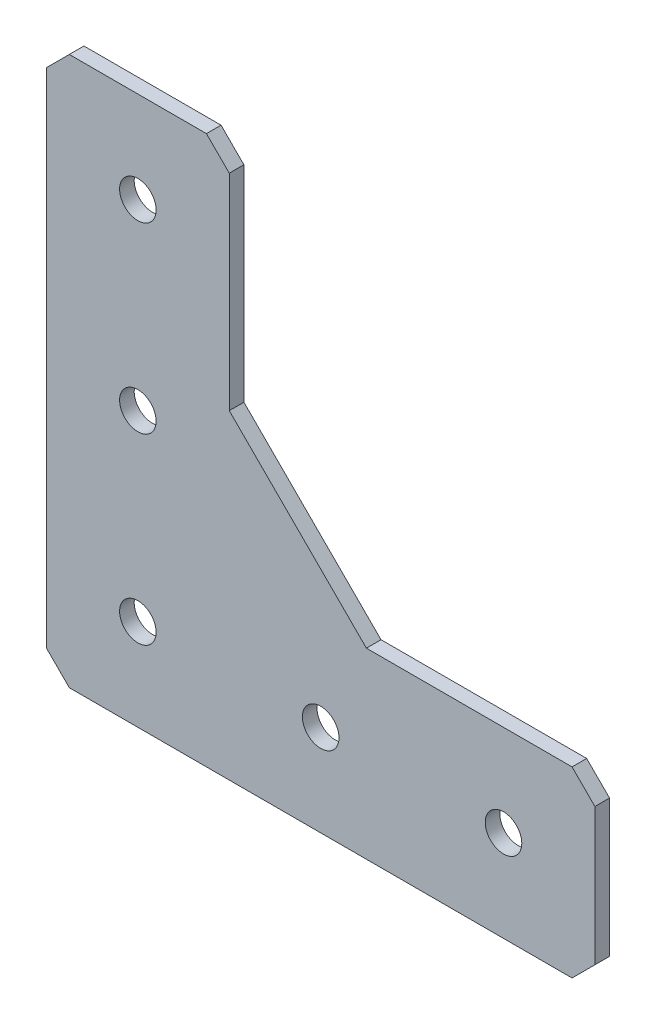
ISO-10303-21;
HEADER;
FILE_DESCRIPTION(('STEP AP214'),'2;1');
FILE_NAME('part.step','',(''),(''),'','','');
FILE_SCHEMA(('AUTOMOTIVE_DESIGN { 1 0 10303 214 1 1 1 1 }'));
ENDSEC;
DATA;
#1=APPLICATION_CONTEXT('core data for automotive mechanical design processes');
#2=APPLICATION_PROTOCOL_DEFINITION('international standard','automotive_design',2000,#1);
#3=PRODUCT_CONTEXT('',#1,'mechanical');
#4=PRODUCT('Part','Part','',(#3));
#5=PRODUCT_RELATED_PRODUCT_CATEGORY('part','',(#4));
#6=PRODUCT_DEFINITION_FORMATION('','',#4);
#7=PRODUCT_DEFINITION_CONTEXT('part definition',#1,'design');
#8=PRODUCT_DEFINITION('design','',#6,#7);
#9=PRODUCT_DEFINITION_SHAPE('','',#8);
#10=(LENGTH_UNIT() NAMED_UNIT(*) SI_UNIT(.MILLI.,.METRE.));
#11=(NAMED_UNIT(*) PLANE_ANGLE_UNIT() SI_UNIT($,.RADIAN.));
#12=(NAMED_UNIT(*) SI_UNIT($,.STERADIAN.) SOLID_ANGLE_UNIT());
#13=UNCERTAINTY_MEASURE_WITH_UNIT(LENGTH_MEASURE(1.E-05),#10,'distance_accuracy_value','');
#14=(GEOMETRIC_REPRESENTATION_CONTEXT(3) GLOBAL_UNCERTAINTY_ASSIGNED_CONTEXT((#13)) GLOBAL_UNIT_ASSIGNED_CONTEXT((#10,
#11,#12)) REPRESENTATION_CONTEXT('',''));
#15=CARTESIAN_POINT('',(0.,0.,0.));
#16=DIRECTION('',(0.,0.,1.));
#17=DIRECTION('',(1.,0.,0.));
#18=AXIS2_PLACEMENT_3D('',#15,#16,#17);
#19=CARTESIAN_POINT('',(0.,0.,1.016));
#20=DIRECTION('',(0.,0.,1.));
#21=DIRECTION('',(1.,0.,0.));
#22=AXIS2_PLACEMENT_3D('',#19,#20,#21);
#23=PLANE('',#22);
#24=CARTESIAN_POINT('',(38.1,12.7,1.016));
#25=DIRECTION('',(0.,0.,1.));
#26=DIRECTION('',(1.,0.,0.));
#27=AXIS2_PLACEMENT_3D('',#24,#25,#26);
#28=CIRCLE('',#27,2.54);
#29=CARTESIAN_POINT('',(40.64,12.7,1.016));
#30=VERTEX_POINT('',#29);
#31=EDGE_CURVE('E298',#30,#30,#28,.T.);
#32=ORIENTED_EDGE('',*,*,#31,.F.);
#33=EDGE_LOOP('',(#32));
#34=FACE_BOUND('',#33,.T.);
#35=CARTESIAN_POINT('',(12.7,38.1,1.016));
#36=DIRECTION('',(0.,0.,1.));
#37=DIRECTION('',(1.,0.,0.));
#38=AXIS2_PLACEMENT_3D('',#35,#36,#37);
#39=CIRCLE('',#38,2.53999999999999);
#40=CARTESIAN_POINT('',(15.24,38.1,1.016));
#41=VERTEX_POINT('',#40);
#42=EDGE_CURVE('E310',#41,#41,#39,.T.);
#43=ORIENTED_EDGE('',*,*,#42,.F.);
#44=EDGE_LOOP('',(#43));
#45=FACE_BOUND('',#44,.T.);
#46=DIRECTION('',(-0.70710678118655,0.707106781186545,0.));
#47=VECTOR('',#46,1.);
#48=CARTESIAN_POINT('',(76.2,22.225,1.016));
#49=LINE('',#48,#47);
#50=CARTESIAN_POINT('',(76.2,22.225,1.016));
#51=VERTEX_POINT('',#50);
#52=CARTESIAN_POINT('',(73.0249999999999,25.4,1.016));
#53=VERTEX_POINT('',#52);
#54=EDGE_CURVE('E179',#51,#53,#49,.T.);
#55=ORIENTED_EDGE('',*,*,#54,.T.);
#56=DIRECTION('',(-1.,0.,0.));
#57=VECTOR('',#56,1.);
#58=CARTESIAN_POINT('',(73.0249999999999,25.4,1.016));
#59=LINE('',#58,#57);
#60=CARTESIAN_POINT('',(44.45,25.4,1.016));
#61=VERTEX_POINT('',#60);
#62=EDGE_CURVE('E107',#53,#61,#59,.T.);
#63=ORIENTED_EDGE('',*,*,#62,.T.);
#64=DIRECTION('',(-0.707106781186544,0.707106781186551,0.));
#65=VECTOR('',#64,1.);
#66=CARTESIAN_POINT('',(44.45,25.4,1.016));
#67=LINE('',#66,#65);
#68=CARTESIAN_POINT('',(25.4,44.4500000000001,1.016));
#69=VERTEX_POINT('',#68);
#70=EDGE_CURVE('E206',#61,#69,#67,.T.);
#71=ORIENTED_EDGE('',*,*,#70,.T.);
#72=DIRECTION('',(0.,1.,0.));
#73=VECTOR('',#72,1.);
#74=CARTESIAN_POINT('',(25.4,44.4500000000001,1.016));
#75=LINE('',#74,#73);
#76=CARTESIAN_POINT('',(25.4,73.025,1.016));
#77=VERTEX_POINT('',#76);
#78=EDGE_CURVE('E225',#69,#77,#75,.T.);
#79=ORIENTED_EDGE('',*,*,#78,.T.);
#80=DIRECTION('',(-0.707106781186545,0.70710678118655,0.));
#81=VECTOR('',#80,1.);
#82=CARTESIAN_POINT('',(25.4,73.025,1.016));
#83=LINE('',#82,#81);
#84=CARTESIAN_POINT('',(22.225,76.2,1.016));
#85=VERTEX_POINT('',#84);
#86=EDGE_CURVE('E222',#77,#85,#83,.T.);
#87=ORIENTED_EDGE('',*,*,#86,.T.);
#88=DIRECTION('',(-1.,0.,0.));
#89=VECTOR('',#88,1.);
#90=CARTESIAN_POINT('',(22.225,76.2,1.016));
#91=LINE('',#90,#89);
#92=CARTESIAN_POINT('',(3.17500000000003,76.2,1.016));
#93=VERTEX_POINT('',#92);
#94=EDGE_CURVE('E224',#85,#93,#91,.T.);
#95=ORIENTED_EDGE('',*,*,#94,.T.);
#96=DIRECTION('',(-0.707106781186553,-0.707106781186542,0.));
#97=VECTOR('',#96,1.);
#98=CARTESIAN_POINT('',(3.17500000000003,76.2,1.016));
#99=LINE('',#98,#97);
#100=CARTESIAN_POINT('',(0.,73.025,1.016));
#101=VERTEX_POINT('',#100);
#102=EDGE_CURVE('E227',#93,#101,#99,.T.);
#103=ORIENTED_EDGE('',*,*,#102,.T.);
#104=DIRECTION('',(0.,-1.,0.));
#105=VECTOR('',#104,1.);
#106=CARTESIAN_POINT('',(0.,73.025,1.016));
#107=LINE('',#106,#105);
#108=CARTESIAN_POINT('',(0.,3.17500000000001,1.016));
#109=VERTEX_POINT('',#108);
#110=EDGE_CURVE('E233',#101,#109,#107,.T.);
#111=ORIENTED_EDGE('',*,*,#110,.T.);
#112=DIRECTION('',(0.707106781186546,-0.707106781186549,0.));
#113=VECTOR('',#112,1.);
#114=CARTESIAN_POINT('',(0.,3.17500000000001,1.016));
#115=LINE('',#114,#113);
#116=CARTESIAN_POINT('',(3.175,0.,1.016));
#117=VERTEX_POINT('',#116);
#118=EDGE_CURVE('E138',#109,#117,#115,.T.);
#119=ORIENTED_EDGE('',*,*,#118,.T.);
#120=DIRECTION('',(1.,0.,0.));
#121=VECTOR('',#120,1.);
#122=CARTESIAN_POINT('',(3.175,0.,1.016));
#123=LINE('',#122,#121);
#124=CARTESIAN_POINT('',(73.0249999999999,0.,1.016));
#125=VERTEX_POINT('',#124);
#126=EDGE_CURVE('E132',#117,#125,#123,.T.);
#127=ORIENTED_EDGE('',*,*,#126,.T.);
#128=DIRECTION('',(0.707106781186551,0.707106781186544,0.));
#129=VECTOR('',#128,1.);
#130=CARTESIAN_POINT('',(73.0249999999999,0.,1.016));
#131=LINE('',#130,#129);
#132=CARTESIAN_POINT('',(76.2,3.175,1.016));
#133=VERTEX_POINT('',#132);
#134=EDGE_CURVE('E136',#125,#133,#131,.T.);
#135=ORIENTED_EDGE('',*,*,#134,.T.);
#136=DIRECTION('',(0.,1.,0.));
#137=VECTOR('',#136,1.);
#138=CARTESIAN_POINT('',(76.2,3.175,1.016));
#139=LINE('',#138,#137);
#140=EDGE_CURVE('E52',#133,#51,#139,.T.);
#141=ORIENTED_EDGE('',*,*,#140,.T.);
#142=EDGE_LOOP('',(#55,#63,#71,#79,#87,#95,#103,#111,#119,#127,#135,#141));
#143=FACE_BOUND('',#142,.T.);
#144=CARTESIAN_POINT('',(12.7,12.7,1.016));
#145=DIRECTION('',(0.,0.,1.));
#146=DIRECTION('',(1.,0.,0.));
#147=AXIS2_PLACEMENT_3D('',#144,#145,#146);
#148=CIRCLE('',#147,2.53999999999999);
#149=CARTESIAN_POINT('',(15.24,12.7,1.016));
#150=VERTEX_POINT('',#149);
#151=EDGE_CURVE('E160',#150,#150,#148,.T.);
#152=ORIENTED_EDGE('',*,*,#151,.F.);
#153=EDGE_LOOP('',(#152));
#154=FACE_BOUND('',#153,.T.);
#155=CARTESIAN_POINT('',(12.7,63.5,1.016));
#156=DIRECTION('',(0.,0.,1.));
#157=DIRECTION('',(1.,0.,0.));
#158=AXIS2_PLACEMENT_3D('',#155,#156,#157);
#159=CIRCLE('',#158,2.53999999999999);
#160=CARTESIAN_POINT('',(15.24,63.5,1.016));
#161=VERTEX_POINT('',#160);
#162=EDGE_CURVE('E304',#161,#161,#159,.T.);
#163=ORIENTED_EDGE('',*,*,#162,.F.);
#164=EDGE_LOOP('',(#163));
#165=FACE_BOUND('',#164,.T.);
#166=CARTESIAN_POINT('',(63.5,12.7,1.016));
#167=DIRECTION('',(0.,0.,1.));
#168=DIRECTION('',(1.,0.,0.));
#169=AXIS2_PLACEMENT_3D('',#166,#167,#168);
#170=CIRCLE('',#169,2.54000000000001);
#171=CARTESIAN_POINT('',(66.04,12.7,1.016));
#172=VERTEX_POINT('',#171);
#173=EDGE_CURVE('E289',#172,#172,#170,.T.);
#174=ORIENTED_EDGE('',*,*,#173,.F.);
#175=EDGE_LOOP('',(#174));
#176=FACE_BOUND('',#175,.T.);
#177=ADVANCED_FACE('F35',(#34,#45,#143,#154,#165,#176),#23,.T.);
#178=CARTESIAN_POINT('',(0.,0.,-1.016));
#179=DIRECTION('',(0.,0.,1.));
#180=DIRECTION('',(1.,0.,0.));
#181=AXIS2_PLACEMENT_3D('',#178,#179,#180);
#182=PLANE('',#181);
#183=CARTESIAN_POINT('',(38.1,12.7,-1.016));
#184=DIRECTION('',(0.,0.,1.));
#185=DIRECTION('',(1.,0.,0.));
#186=AXIS2_PLACEMENT_3D('',#183,#184,#185);
#187=CIRCLE('',#186,2.54);
#188=CARTESIAN_POINT('',(40.64,12.7,-1.016));
#189=VERTEX_POINT('',#188);
#190=EDGE_CURVE('E295',#189,#189,#187,.T.);
#191=ORIENTED_EDGE('',*,*,#190,.T.);
#192=EDGE_LOOP('',(#191));
#193=FACE_BOUND('',#192,.T.);
#194=CARTESIAN_POINT('',(12.7,38.1,-1.016));
#195=DIRECTION('',(0.,0.,1.));
#196=DIRECTION('',(1.,0.,0.));
#197=AXIS2_PLACEMENT_3D('',#194,#195,#196);
#198=CIRCLE('',#197,2.53999999999999);
#199=CARTESIAN_POINT('',(15.24,38.1,-1.016));
#200=VERTEX_POINT('',#199);
#201=EDGE_CURVE('E307',#200,#200,#198,.T.);
#202=ORIENTED_EDGE('',*,*,#201,.T.);
#203=EDGE_LOOP('',(#202));
#204=FACE_BOUND('',#203,.T.);
#205=DIRECTION('',(-0.70710678118655,0.707106781186545,0.));
#206=VECTOR('',#205,1.);
#207=CARTESIAN_POINT('',(76.2,22.225,-1.016));
#208=LINE('',#207,#206);
#209=CARTESIAN_POINT('',(76.2,22.225,-1.016));
#210=VERTEX_POINT('',#209);
#211=CARTESIAN_POINT('',(73.0249999999999,25.4,-1.016));
#212=VERTEX_POINT('',#211);
#213=EDGE_CURVE('E156',#210,#212,#208,.T.);
#214=ORIENTED_EDGE('',*,*,#213,.F.);
#215=DIRECTION('',(0.,1.,0.));
#216=VECTOR('',#215,1.);
#217=CARTESIAN_POINT('',(76.2,3.175,-1.016));
#218=LINE('',#217,#216);
#219=CARTESIAN_POINT('',(76.2,3.175,-1.016));
#220=VERTEX_POINT('',#219);
#221=EDGE_CURVE('E99',#220,#210,#218,.T.);
#222=ORIENTED_EDGE('',*,*,#221,.F.);
#223=DIRECTION('',(0.707106781186551,0.707106781186544,0.));
#224=VECTOR('',#223,1.);
#225=CARTESIAN_POINT('',(73.0249999999999,0.,-1.016));
#226=LINE('',#225,#224);
#227=CARTESIAN_POINT('',(73.0249999999999,0.,-1.016));
#228=VERTEX_POINT('',#227);
#229=EDGE_CURVE('E93',#228,#220,#226,.T.);
#230=ORIENTED_EDGE('',*,*,#229,.F.);
#231=DIRECTION('',(1.,0.,0.));
#232=VECTOR('',#231,1.);
#233=CARTESIAN_POINT('',(3.175,0.,-1.016));
#234=LINE('',#233,#232);
#235=CARTESIAN_POINT('',(3.175,0.,-1.016));
#236=VERTEX_POINT('',#235);
#237=EDGE_CURVE('E146',#236,#228,#234,.T.);
#238=ORIENTED_EDGE('',*,*,#237,.F.);
#239=DIRECTION('',(0.707106781186546,-0.707106781186549,0.));
#240=VECTOR('',#239,1.);
#241=CARTESIAN_POINT('',(0.,3.17500000000001,-1.016));
#242=LINE('',#241,#240);
#243=CARTESIAN_POINT('',(0.,3.17500000000001,-1.016));
#244=VERTEX_POINT('',#243);
#245=EDGE_CURVE('E174',#244,#236,#242,.T.);
#246=ORIENTED_EDGE('',*,*,#245,.F.);
#247=DIRECTION('',(0.,-1.,0.));
#248=VECTOR('',#247,1.);
#249=CARTESIAN_POINT('',(0.,73.025,-1.016));
#250=LINE('',#249,#248);
#251=CARTESIAN_POINT('',(0.,73.025,-1.016));
#252=VERTEX_POINT('',#251);
#253=EDGE_CURVE('E172',#252,#244,#250,.T.);
#254=ORIENTED_EDGE('',*,*,#253,.F.);
#255=DIRECTION('',(-0.707106781186553,-0.707106781186542,0.));
#256=VECTOR('',#255,1.);
#257=CARTESIAN_POINT('',(3.17500000000003,76.2,-1.016));
#258=LINE('',#257,#256);
#259=CARTESIAN_POINT('',(3.17500000000003,76.2,-1.016));
#260=VERTEX_POINT('',#259);
#261=EDGE_CURVE('E170',#260,#252,#258,.T.);
#262=ORIENTED_EDGE('',*,*,#261,.F.);
#263=DIRECTION('',(-1.,0.,0.));
#264=VECTOR('',#263,1.);
#265=CARTESIAN_POINT('',(22.225,76.2,-1.016));
#266=LINE('',#265,#264);
#267=CARTESIAN_POINT('',(22.225,76.2,-1.016));
#268=VERTEX_POINT('',#267);
#269=EDGE_CURVE('E168',#268,#260,#266,.T.);
#270=ORIENTED_EDGE('',*,*,#269,.F.);
#271=DIRECTION('',(-0.707106781186545,0.70710678118655,0.));
#272=VECTOR('',#271,1.);
#273=CARTESIAN_POINT('',(25.4,73.025,-1.016));
#274=LINE('',#273,#272);
#275=CARTESIAN_POINT('',(25.4,73.025,-1.016));
#276=VERTEX_POINT('',#275);
#277=EDGE_CURVE('E166',#276,#268,#274,.T.);
#278=ORIENTED_EDGE('',*,*,#277,.F.);
#279=DIRECTION('',(0.,1.,0.));
#280=VECTOR('',#279,1.);
#281=CARTESIAN_POINT('',(25.4,44.4500000000001,-1.016));
#282=LINE('',#281,#280);
#283=CARTESIAN_POINT('',(25.4,44.4500000000001,-1.016));
#284=VERTEX_POINT('',#283);
#285=EDGE_CURVE('E164',#284,#276,#282,.T.);
#286=ORIENTED_EDGE('',*,*,#285,.F.);
#287=DIRECTION('',(-0.707106781186544,0.707106781186551,0.));
#288=VECTOR('',#287,1.);
#289=CARTESIAN_POINT('',(44.45,25.4,-1.016));
#290=LINE('',#289,#288);
#291=CARTESIAN_POINT('',(44.45,25.4,-1.016));
#292=VERTEX_POINT('',#291);
#293=EDGE_CURVE('E162',#292,#284,#290,.T.);
#294=ORIENTED_EDGE('',*,*,#293,.F.);
#295=DIRECTION('',(-1.,0.,0.));
#296=VECTOR('',#295,1.);
#297=CARTESIAN_POINT('',(73.0249999999999,25.4,-1.016));
#298=LINE('',#297,#296);
#299=EDGE_CURVE('E159',#212,#292,#298,.T.);
#300=ORIENTED_EDGE('',*,*,#299,.F.);
#301=EDGE_LOOP('',(#214,#222,#230,#238,#246,#254,#262,#270,#278,#286,#294,#300));
#302=FACE_BOUND('',#301,.T.);
#303=CARTESIAN_POINT('',(12.7,12.7,-1.016));
#304=DIRECTION('',(0.,0.,1.));
#305=DIRECTION('',(1.,0.,0.));
#306=AXIS2_PLACEMENT_3D('',#303,#304,#305);
#307=CIRCLE('',#306,2.53999999999999);
#308=CARTESIAN_POINT('',(15.24,12.7,-1.016));
#309=VERTEX_POINT('',#308);
#310=EDGE_CURVE('E313',#309,#309,#307,.T.);
#311=ORIENTED_EDGE('',*,*,#310,.T.);
#312=EDGE_LOOP('',(#311));
#313=FACE_BOUND('',#312,.T.);
#314=CARTESIAN_POINT('',(12.7,63.5,-1.016));
#315=DIRECTION('',(0.,0.,1.));
#316=DIRECTION('',(1.,0.,0.));
#317=AXIS2_PLACEMENT_3D('',#314,#315,#316);
#318=CIRCLE('',#317,2.53999999999999);
#319=CARTESIAN_POINT('',(15.24,63.5,-1.016));
#320=VERTEX_POINT('',#319);
#321=EDGE_CURVE('E301',#320,#320,#318,.T.);
#322=ORIENTED_EDGE('',*,*,#321,.T.);
#323=EDGE_LOOP('',(#322));
#324=FACE_BOUND('',#323,.T.);
#325=CARTESIAN_POINT('',(63.5,12.7,-1.016));
#326=DIRECTION('',(0.,0.,1.));
#327=DIRECTION('',(1.,0.,0.));
#328=AXIS2_PLACEMENT_3D('',#325,#326,#327);
#329=CIRCLE('',#328,2.54000000000001);
#330=CARTESIAN_POINT('',(66.04,12.7,-1.016));
#331=VERTEX_POINT('',#330);
#332=EDGE_CURVE('E292',#331,#331,#329,.T.);
#333=ORIENTED_EDGE('',*,*,#332,.T.);
#334=EDGE_LOOP('',(#333));
#335=FACE_BOUND('',#334,.T.);
#336=ADVANCED_FACE('F210',(#193,#204,#302,#313,#324,#335),#182,.F.);
#337=CARTESIAN_POINT('',(76.2,22.225,1.016));
#338=DIRECTION('',(-0.707106781186545,-0.70710678118655,0.));
#339=DIRECTION('',(0.70710678118655,-0.707106781186545,0.));
#340=AXIS2_PLACEMENT_3D('',#337,#338,#339);
#341=PLANE('',#340);
#342=ORIENTED_EDGE('',*,*,#213,.T.);
#343=DIRECTION('',(0.,0.,-1.));
#344=VECTOR('',#343,1.);
#345=CARTESIAN_POINT('',(73.0249999999999,25.4,1.016));
#346=LINE('',#345,#344);
#347=EDGE_CURVE('E11',#53,#212,#346,.T.);
#348=ORIENTED_EDGE('',*,*,#347,.F.);
#349=ORIENTED_EDGE('',*,*,#54,.F.);
#350=DIRECTION('',(0.,0.,-1.));
#351=VECTOR('',#350,1.);
#352=CARTESIAN_POINT('',(76.2,22.225,1.016));
#353=LINE('',#352,#351);
#354=EDGE_CURVE('E152',#51,#210,#353,.T.);
#355=ORIENTED_EDGE('',*,*,#354,.T.);
#356=EDGE_LOOP('',(#342,#348,#349,#355));
#357=FACE_BOUND('',#356,.T.);
#358=ADVANCED_FACE('F37',(#357),#341,.F.);
#359=CARTESIAN_POINT('',(73.0249999999999,25.4,1.016));
#360=DIRECTION('',(0.,-1.,0.));
#361=DIRECTION('',(1.,0.,0.));
#362=AXIS2_PLACEMENT_3D('',#359,#360,#361);
#363=PLANE('',#362);
#364=ORIENTED_EDGE('',*,*,#299,.T.);
#365=DIRECTION('',(0.,0.,-1.));
#366=VECTOR('',#365,1.);
#367=CARTESIAN_POINT('',(44.45,25.4,1.016));
#368=LINE('',#367,#366);
#369=EDGE_CURVE('E44',#61,#292,#368,.T.);
#370=ORIENTED_EDGE('',*,*,#369,.F.);
#371=ORIENTED_EDGE('',*,*,#62,.F.);
#372=ORIENTED_EDGE('',*,*,#347,.T.);
#373=EDGE_LOOP('',(#364,#370,#371,#372));
#374=FACE_BOUND('',#373,.T.);
#375=ADVANCED_FACE('F431',(#374),#363,.F.);
#376=CARTESIAN_POINT('',(44.45,25.4,1.016));
#377=DIRECTION('',(-0.707106781186551,-0.707106781186544,0.));
#378=DIRECTION('',(0.707106781186544,-0.707106781186551,0.));
#379=AXIS2_PLACEMENT_3D('',#376,#377,#378);
#380=PLANE('',#379);
#381=ORIENTED_EDGE('',*,*,#293,.T.);
#382=DIRECTION('',(0.,0.,-1.));
#383=VECTOR('',#382,1.);
#384=CARTESIAN_POINT('',(25.4,44.4500000000001,1.016));
#385=LINE('',#384,#383);
#386=EDGE_CURVE('E198',#69,#284,#385,.T.);
#387=ORIENTED_EDGE('',*,*,#386,.F.);
#388=ORIENTED_EDGE('',*,*,#70,.F.);
#389=ORIENTED_EDGE('',*,*,#369,.T.);
#390=EDGE_LOOP('',(#381,#387,#388,#389));
#391=FACE_BOUND('',#390,.T.);
#392=ADVANCED_FACE('F204',(#391),#380,.F.);
#393=CARTESIAN_POINT('',(25.4,44.4500000000001,1.016));
#394=DIRECTION('',(-1.,0.,0.));
#395=DIRECTION('',(0.,-1.,0.));
#396=AXIS2_PLACEMENT_3D('',#393,#394,#395);
#397=PLANE('',#396);
#398=ORIENTED_EDGE('',*,*,#285,.T.);
#399=DIRECTION('',(0.,0.,-1.));
#400=VECTOR('',#399,1.);
#401=CARTESIAN_POINT('',(25.4,73.025,1.016));
#402=LINE('',#401,#400);
#403=EDGE_CURVE('E195',#77,#276,#402,.T.);
#404=ORIENTED_EDGE('',*,*,#403,.F.);
#405=ORIENTED_EDGE('',*,*,#78,.F.);
#406=ORIENTED_EDGE('',*,*,#386,.T.);
#407=EDGE_LOOP('',(#398,#404,#405,#406));
#408=FACE_BOUND('',#407,.T.);
#409=ADVANCED_FACE('F216',(#408),#397,.F.);
#410=CARTESIAN_POINT('',(25.4,73.025,1.016));
#411=DIRECTION('',(-0.70710678118655,-0.707106781186545,0.));
#412=DIRECTION('',(0.707106781186545,-0.70710678118655,0.));
#413=AXIS2_PLACEMENT_3D('',#410,#411,#412);
#414=PLANE('',#413);
#415=ORIENTED_EDGE('',*,*,#277,.T.);
#416=DIRECTION('',(0.,0.,-1.));
#417=VECTOR('',#416,1.);
#418=CARTESIAN_POINT('',(22.225,76.2,1.016));
#419=LINE('',#418,#417);
#420=EDGE_CURVE('E192',#85,#268,#419,.T.);
#421=ORIENTED_EDGE('',*,*,#420,.F.);
#422=ORIENTED_EDGE('',*,*,#86,.F.);
#423=ORIENTED_EDGE('',*,*,#403,.T.);
#424=EDGE_LOOP('',(#415,#421,#422,#423));
#425=FACE_BOUND('',#424,.T.);
#426=ADVANCED_FACE('F220',(#425),#414,.F.);
#427=CARTESIAN_POINT('',(22.225,76.2,1.016));
#428=DIRECTION('',(0.,-1.,0.));
#429=DIRECTION('',(0.,0.,-1.));
#430=AXIS2_PLACEMENT_3D('',#427,#428,#429);
#431=PLANE('',#430);
#432=ORIENTED_EDGE('',*,*,#269,.T.);
#433=DIRECTION('',(0.,0.,-1.));
#434=VECTOR('',#433,1.);
#435=CARTESIAN_POINT('',(3.17500000000003,76.2,1.016));
#436=LINE('',#435,#434);
#437=EDGE_CURVE('E189',#93,#260,#436,.T.);
#438=ORIENTED_EDGE('',*,*,#437,.F.);
#439=ORIENTED_EDGE('',*,*,#94,.F.);
#440=ORIENTED_EDGE('',*,*,#420,.T.);
#441=EDGE_LOOP('',(#432,#438,#439,#440));
#442=FACE_BOUND('',#441,.T.);
#443=ADVANCED_FACE('F396',(#442),#431,.F.);
#444=CARTESIAN_POINT('',(3.17500000000003,76.2,1.016));
#445=DIRECTION('',(0.707106781186542,-0.707106781186553,0.));
#446=DIRECTION('',(0.707106781186553,0.707106781186542,0.));
#447=AXIS2_PLACEMENT_3D('',#444,#445,#446);
#448=PLANE('',#447);
#449=ORIENTED_EDGE('',*,*,#261,.T.);
#450=DIRECTION('',(0.,0.,-1.));
#451=VECTOR('',#450,1.);
#452=CARTESIAN_POINT('',(0.,73.025,1.016));
#453=LINE('',#452,#451);
#454=EDGE_CURVE('E186',#101,#252,#453,.T.);
#455=ORIENTED_EDGE('',*,*,#454,.F.);
#456=ORIENTED_EDGE('',*,*,#102,.F.);
#457=ORIENTED_EDGE('',*,*,#437,.T.);
#458=EDGE_LOOP('',(#449,#455,#456,#457));
#459=FACE_BOUND('',#458,.T.);
#460=ADVANCED_FACE('F387',(#459),#448,.F.);
#461=CARTESIAN_POINT('',(0.,73.025,1.016));
#462=DIRECTION('',(1.,0.,0.));
#463=DIRECTION('',(0.,1.,0.));
#464=AXIS2_PLACEMENT_3D('',#461,#462,#463);
#465=PLANE('',#464);
#466=ORIENTED_EDGE('',*,*,#253,.T.);
#467=DIRECTION('',(0.,0.,-1.));
#468=VECTOR('',#467,1.);
#469=CARTESIAN_POINT('',(0.,3.17500000000001,1.016));
#470=LINE('',#469,#468);
#471=EDGE_CURVE('E183',#109,#244,#470,.T.);
#472=ORIENTED_EDGE('',*,*,#471,.F.);
#473=ORIENTED_EDGE('',*,*,#110,.F.);
#474=ORIENTED_EDGE('',*,*,#454,.T.);
#475=EDGE_LOOP('',(#466,#472,#473,#474));
#476=FACE_BOUND('',#475,.T.);
#477=ADVANCED_FACE('F239',(#476),#465,.F.);
#478=CARTESIAN_POINT('',(0.,3.17500000000001,1.016));
#479=DIRECTION('',(0.707106781186549,0.707106781186546,0.));
#480=DIRECTION('',(-0.707106781186546,0.707106781186549,0.));
#481=AXIS2_PLACEMENT_3D('',#478,#479,#480);
#482=PLANE('',#481);
#483=ORIENTED_EDGE('',*,*,#245,.T.);
#484=DIRECTION('',(0.,0.,-1.));
#485=VECTOR('',#484,1.);
#486=CARTESIAN_POINT('',(3.175,0.,1.016));
#487=LINE('',#486,#485);
#488=EDGE_CURVE('E147',#117,#236,#487,.T.);
#489=ORIENTED_EDGE('',*,*,#488,.F.);
#490=ORIENTED_EDGE('',*,*,#118,.F.);
#491=ORIENTED_EDGE('',*,*,#471,.T.);
#492=EDGE_LOOP('',(#483,#489,#490,#491));
#493=FACE_BOUND('',#492,.T.);
#494=ADVANCED_FACE('F243',(#493),#482,.F.);
#495=CARTESIAN_POINT('',(3.175,0.,1.016));
#496=DIRECTION('',(0.,1.,0.));
#497=DIRECTION('',(-1.,0.,0.));
#498=AXIS2_PLACEMENT_3D('',#495,#496,#497);
#499=PLANE('',#498);
#500=ORIENTED_EDGE('',*,*,#237,.T.);
#501=DIRECTION('',(0.,0.,-1.));
#502=VECTOR('',#501,1.);
#503=CARTESIAN_POINT('',(73.0249999999999,0.,1.016));
#504=LINE('',#503,#502);
#505=EDGE_CURVE('E143',#125,#228,#504,.T.);
#506=ORIENTED_EDGE('',*,*,#505,.F.);
#507=ORIENTED_EDGE('',*,*,#126,.F.);
#508=ORIENTED_EDGE('',*,*,#488,.T.);
#509=EDGE_LOOP('',(#500,#506,#507,#508));
#510=FACE_BOUND('',#509,.T.);
#511=ADVANCED_FACE('F144',(#510),#499,.F.);
#512=CARTESIAN_POINT('',(73.0249999999999,0.,1.016));
#513=DIRECTION('',(-0.707106781186544,0.707106781186551,0.));
#514=DIRECTION('',(-0.707106781186551,-0.707106781186544,0.));
#515=AXIS2_PLACEMENT_3D('',#512,#513,#514);
#516=PLANE('',#515);
#517=ORIENTED_EDGE('',*,*,#229,.T.);
#518=DIRECTION('',(0.,0.,-1.));
#519=VECTOR('',#518,1.);
#520=CARTESIAN_POINT('',(76.2,3.175,1.016));
#521=LINE('',#520,#519);
#522=EDGE_CURVE('E148',#133,#220,#521,.T.);
#523=ORIENTED_EDGE('',*,*,#522,.F.);
#524=ORIENTED_EDGE('',*,*,#134,.F.);
#525=ORIENTED_EDGE('',*,*,#505,.T.);
#526=EDGE_LOOP('',(#517,#523,#524,#525));
#527=FACE_BOUND('',#526,.T.);
#528=ADVANCED_FACE('F150',(#527),#516,.F.);
#529=CARTESIAN_POINT('',(76.2,3.175,1.016));
#530=DIRECTION('',(-1.,0.,0.));
#531=DIRECTION('',(0.,0.,1.));
#532=AXIS2_PLACEMENT_3D('',#529,#530,#531);
#533=PLANE('',#532);
#534=ORIENTED_EDGE('',*,*,#221,.T.);
#535=ORIENTED_EDGE('',*,*,#354,.F.);
#536=ORIENTED_EDGE('',*,*,#140,.F.);
#537=ORIENTED_EDGE('',*,*,#522,.T.);
#538=EDGE_LOOP('',(#534,#535,#536,#537));
#539=FACE_BOUND('',#538,.T.);
#540=ADVANCED_FACE('F247',(#539),#533,.F.);
#541=CARTESIAN_POINT('',(12.7,12.7,1.016));
#542=DIRECTION('',(0.,0.,-1.));
#543=DIRECTION('',(-1.,0.,0.));
#544=AXIS2_PLACEMENT_3D('',#541,#542,#543);
#545=CYLINDRICAL_SURFACE('',#544,2.53999999999999);
#546=ORIENTED_EDGE('',*,*,#151,.T.);
#547=EDGE_LOOP('',(#546));
#548=FACE_BOUND('',#547,.T.);
#549=ORIENTED_EDGE('',*,*,#310,.F.);
#550=EDGE_LOOP('',(#549));
#551=FACE_BOUND('',#550,.T.);
#552=ADVANCED_FACE('F249',(#548,#551),#545,.F.);
#553=CARTESIAN_POINT('',(12.7,38.1,1.016));
#554=DIRECTION('',(0.,0.,-1.));
#555=DIRECTION('',(-1.,0.,0.));
#556=AXIS2_PLACEMENT_3D('',#553,#554,#555);
#557=CYLINDRICAL_SURFACE('',#556,2.53999999999999);
#558=ORIENTED_EDGE('',*,*,#42,.T.);
#559=EDGE_LOOP('',(#558));
#560=FACE_BOUND('',#559,.T.);
#561=ORIENTED_EDGE('',*,*,#201,.F.);
#562=EDGE_LOOP('',(#561));
#563=FACE_BOUND('',#562,.T.);
#564=ADVANCED_FACE('F255',(#560,#563),#557,.F.);
#565=CARTESIAN_POINT('',(12.7,63.5,1.016));
#566=DIRECTION('',(0.,0.,-1.));
#567=DIRECTION('',(-1.,0.,0.));
#568=AXIS2_PLACEMENT_3D('',#565,#566,#567);
#569=CYLINDRICAL_SURFACE('',#568,2.53999999999999);
#570=ORIENTED_EDGE('',*,*,#162,.T.);
#571=EDGE_LOOP('',(#570));
#572=FACE_BOUND('',#571,.T.);
#573=ORIENTED_EDGE('',*,*,#321,.F.);
#574=EDGE_LOOP('',(#573));
#575=FACE_BOUND('',#574,.T.);
#576=ADVANCED_FACE('F272',(#572,#575),#569,.F.);
#577=CARTESIAN_POINT('',(38.1,12.7,1.016));
#578=DIRECTION('',(0.,0.,-1.));
#579=DIRECTION('',(-1.,0.,0.));
#580=AXIS2_PLACEMENT_3D('',#577,#578,#579);
#581=CYLINDRICAL_SURFACE('',#580,2.54);
#582=ORIENTED_EDGE('',*,*,#31,.T.);
#583=EDGE_LOOP('',(#582));
#584=FACE_BOUND('',#583,.T.);
#585=ORIENTED_EDGE('',*,*,#190,.F.);
#586=EDGE_LOOP('',(#585));
#587=FACE_BOUND('',#586,.T.);
#588=ADVANCED_FACE('F276',(#584,#587),#581,.F.);
#589=CARTESIAN_POINT('',(63.5,12.7,1.016));
#590=DIRECTION('',(0.,0.,-1.));
#591=DIRECTION('',(-1.,0.,0.));
#592=AXIS2_PLACEMENT_3D('',#589,#590,#591);
#593=CYLINDRICAL_SURFACE('',#592,2.54000000000001);
#594=ORIENTED_EDGE('',*,*,#173,.T.);
#595=EDGE_LOOP('',(#594));
#596=FACE_BOUND('',#595,.T.);
#597=ORIENTED_EDGE('',*,*,#332,.F.);
#598=EDGE_LOOP('',(#597));
#599=FACE_BOUND('',#598,.T.);
#600=ADVANCED_FACE('F280',(#596,#599),#593,.F.);
#601=CLOSED_SHELL('',(#177,#336,#358,#375,#392,#409,#426,#443,#460,#477,#494,#511,#528,#540,
#552,#564,#576,#588,#600));
#602=MANIFOLD_SOLID_BREP('B2',#601);
#603=ADVANCED_BREP_SHAPE_REPRESENTATION('',(#18,#602),#14);
#604=SHAPE_DEFINITION_REPRESENTATION(#9,#603);
ENDSEC;
END-ISO-10303-21;
